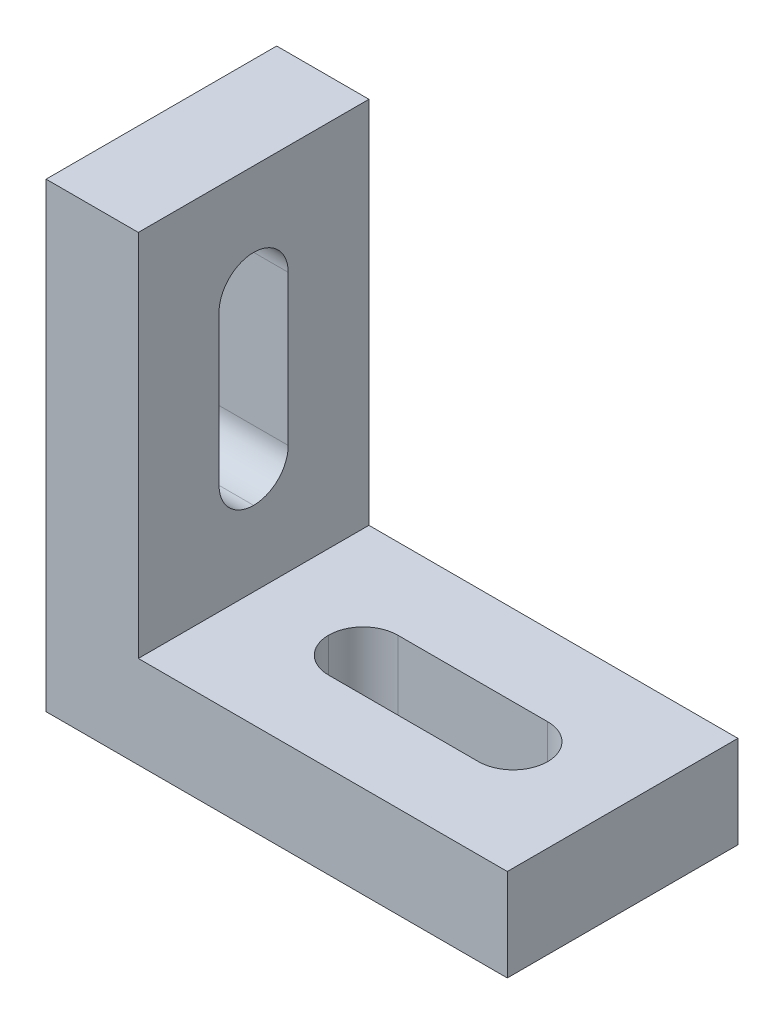
ISO-10303-21;
HEADER;
FILE_DESCRIPTION(('STEP AP214'),'2;1');
FILE_NAME('part.step','',(''),(''),'','','');
FILE_SCHEMA(('AUTOMOTIVE_DESIGN { 1 0 10303 214 1 1 1 1 }'));
ENDSEC;
DATA;
#1=APPLICATION_CONTEXT('core data for automotive mechanical design processes');
#2=APPLICATION_PROTOCOL_DEFINITION('international standard','automotive_design',2000,#1);
#3=PRODUCT_CONTEXT('',#1,'mechanical');
#4=PRODUCT('Part','Part','',(#3));
#5=PRODUCT_RELATED_PRODUCT_CATEGORY('part','',(#4));
#6=PRODUCT_DEFINITION_FORMATION('','',#4);
#7=PRODUCT_DEFINITION_CONTEXT('part definition',#1,'design');
#8=PRODUCT_DEFINITION('design','',#6,#7);
#9=PRODUCT_DEFINITION_SHAPE('','',#8);
#10=(LENGTH_UNIT() NAMED_UNIT(*) SI_UNIT(.MILLI.,.METRE.));
#11=(NAMED_UNIT(*) PLANE_ANGLE_UNIT() SI_UNIT($,.RADIAN.));
#12=(NAMED_UNIT(*) SI_UNIT($,.STERADIAN.) SOLID_ANGLE_UNIT());
#13=UNCERTAINTY_MEASURE_WITH_UNIT(LENGTH_MEASURE(1.E-05),#10,'distance_accuracy_value','');
#14=(GEOMETRIC_REPRESENTATION_CONTEXT(3) GLOBAL_UNCERTAINTY_ASSIGNED_CONTEXT((#13)) GLOBAL_UNIT_ASSIGNED_CONTEXT((#10,
#11,#12)) REPRESENTATION_CONTEXT('',''));
#15=CARTESIAN_POINT('',(0.,0.,0.));
#16=DIRECTION('',(0.,0.,1.));
#17=DIRECTION('',(1.,0.,0.));
#18=AXIS2_PLACEMENT_3D('',#15,#16,#17);
#19=CARTESIAN_POINT('',(4.,-20.,20.));
#20=DIRECTION('',(0.,1.,0.));
#21=DIRECTION('',(0.,0.,1.));
#22=AXIS2_PLACEMENT_3D('',#19,#20,#21);
#23=PLANE('',#22);
#24=DIRECTION('',(1.,0.,0.));
#25=VECTOR('',#24,1.);
#26=CARTESIAN_POINT('',(4.,-20.,13.));
#27=LINE('',#26,#25);
#28=CARTESIAN_POINT('',(13.5,-20.,13.));
#29=VERTEX_POINT('',#28);
#30=CARTESIAN_POINT('',(26.5,-20.,13.));
#31=VERTEX_POINT('',#30);
#32=EDGE_CURVE('E368',#29,#31,#27,.T.);
#33=ORIENTED_EDGE('',*,*,#32,.T.);
#34=CARTESIAN_POINT('',(26.5,-20.,10.));
#35=DIRECTION('',(0.,1.,0.));
#36=DIRECTION('',(0.,0.,1.));
#37=AXIS2_PLACEMENT_3D('',#34,#35,#36);
#38=CIRCLE('',#37,3.);
#39=CARTESIAN_POINT('',(29.5,-20.,10.));
#40=VERTEX_POINT('',#39);
#41=EDGE_CURVE('E288',#31,#40,#38,.T.);
#42=ORIENTED_EDGE('',*,*,#41,.T.);
#43=CARTESIAN_POINT('',(26.5,-20.,10.));
#44=DIRECTION('',(0.,1.,0.));
#45=DIRECTION('',(0.,0.,1.));
#46=AXIS2_PLACEMENT_3D('',#43,#44,#45);
#47=CIRCLE('',#46,3.);
#48=CARTESIAN_POINT('',(26.5,-20.,7.));
#49=VERTEX_POINT('',#48);
#50=EDGE_CURVE('E282',#40,#49,#47,.T.);
#51=ORIENTED_EDGE('',*,*,#50,.T.);
#52=DIRECTION('',(-1.,0.,0.));
#53=VECTOR('',#52,1.);
#54=CARTESIAN_POINT('',(4.,-20.,7.00000000000001));
#55=LINE('',#54,#53);
#56=CARTESIAN_POINT('',(13.5,-20.,7.));
#57=VERTEX_POINT('',#56);
#58=EDGE_CURVE('E214',#49,#57,#55,.T.);
#59=ORIENTED_EDGE('',*,*,#58,.T.);
#60=CARTESIAN_POINT('',(13.5,-20.,10.));
#61=DIRECTION('',(0.,1.,0.));
#62=DIRECTION('',(0.,0.,1.));
#63=AXIS2_PLACEMENT_3D('',#60,#61,#62);
#64=CIRCLE('',#63,3.);
#65=CARTESIAN_POINT('',(10.5,-20.,10.));
#66=VERTEX_POINT('',#65);
#67=EDGE_CURVE('E294',#57,#66,#64,.T.);
#68=ORIENTED_EDGE('',*,*,#67,.T.);
#69=CARTESIAN_POINT('',(13.5,-20.,10.));
#70=DIRECTION('',(0.,1.,0.));
#71=DIRECTION('',(0.,0.,1.));
#72=AXIS2_PLACEMENT_3D('',#69,#70,#71);
#73=CIRCLE('',#72,3.);
#74=EDGE_CURVE('E300',#66,#29,#73,.T.);
#75=ORIENTED_EDGE('',*,*,#74,.T.);
#76=EDGE_LOOP('',(#33,#42,#51,#59,#68,#75));
#77=FACE_BOUND('',#76,.T.);
#78=DIRECTION('',(1.,0.,0.));
#79=VECTOR('',#78,1.);
#80=CARTESIAN_POINT('',(4.,-20.,0.));
#81=LINE('',#80,#79);
#82=CARTESIAN_POINT('',(-4.,-20.,0.));
#83=VERTEX_POINT('',#82);
#84=CARTESIAN_POINT('',(36.,-20.,0.));
#85=VERTEX_POINT('',#84);
#86=EDGE_CURVE('E185',#83,#85,#81,.T.);
#87=ORIENTED_EDGE('',*,*,#86,.T.);
#88=DIRECTION('',(0.,0.,-1.));
#89=VECTOR('',#88,1.);
#90=CARTESIAN_POINT('',(36.,-20.,20.));
#91=LINE('',#90,#89);
#92=CARTESIAN_POINT('',(36.,-20.,20.));
#93=VERTEX_POINT('',#92);
#94=EDGE_CURVE('E184',#93,#85,#91,.T.);
#95=ORIENTED_EDGE('',*,*,#94,.F.);
#96=DIRECTION('',(1.,0.,0.));
#97=VECTOR('',#96,1.);
#98=CARTESIAN_POINT('',(-4.,-20.,20.));
#99=LINE('',#98,#97);
#100=CARTESIAN_POINT('',(-4.,-20.,20.));
#101=VERTEX_POINT('',#100);
#102=EDGE_CURVE('E169',#101,#93,#99,.T.);
#103=ORIENTED_EDGE('',*,*,#102,.F.);
#104=DIRECTION('',(0.,0.,-1.));
#105=VECTOR('',#104,1.);
#106=CARTESIAN_POINT('',(-4.,-20.,20.));
#107=LINE('',#106,#105);
#108=EDGE_CURVE('E210',#101,#83,#107,.T.);
#109=ORIENTED_EDGE('',*,*,#108,.T.);
#110=EDGE_LOOP('',(#87,#95,#103,#109));
#111=FACE_BOUND('',#110,.T.);
#112=ADVANCED_FACE('F43',(#77,#111),#23,.F.);
#113=CARTESIAN_POINT('',(36.,-20.,20.));
#114=DIRECTION('',(-1.,0.,0.));
#115=DIRECTION('',(0.,0.,1.));
#116=AXIS2_PLACEMENT_3D('',#113,#114,#115);
#117=PLANE('',#116);
#118=DIRECTION('',(0.,1.,0.));
#119=VECTOR('',#118,1.);
#120=CARTESIAN_POINT('',(36.,-20.,0.));
#121=LINE('',#120,#119);
#122=CARTESIAN_POINT('',(36.,-12.,0.));
#123=VERTEX_POINT('',#122);
#124=EDGE_CURVE('E213',#85,#123,#121,.T.);
#125=ORIENTED_EDGE('',*,*,#124,.T.);
#126=DIRECTION('',(0.,0.,-1.));
#127=VECTOR('',#126,1.);
#128=CARTESIAN_POINT('',(36.,-12.,20.));
#129=LINE('',#128,#127);
#130=CARTESIAN_POINT('',(36.,-12.,20.));
#131=VERTEX_POINT('',#130);
#132=EDGE_CURVE('E190',#131,#123,#129,.T.);
#133=ORIENTED_EDGE('',*,*,#132,.F.);
#134=DIRECTION('',(0.,1.,0.));
#135=VECTOR('',#134,1.);
#136=CARTESIAN_POINT('',(36.,-20.,20.));
#137=LINE('',#136,#135);
#138=EDGE_CURVE('E173',#93,#131,#137,.T.);
#139=ORIENTED_EDGE('',*,*,#138,.F.);
#140=ORIENTED_EDGE('',*,*,#94,.T.);
#141=EDGE_LOOP('',(#125,#133,#139,#140));
#142=FACE_BOUND('',#141,.T.);
#143=ADVANCED_FACE('F192',(#142),#117,.F.);
#144=CARTESIAN_POINT('',(36.,-12.,20.));
#145=DIRECTION('',(0.,-1.,0.));
#146=DIRECTION('',(0.,0.,-1.));
#147=AXIS2_PLACEMENT_3D('',#144,#145,#146);
#148=PLANE('',#147);
#149=DIRECTION('',(1.,0.,0.));
#150=VECTOR('',#149,1.);
#151=CARTESIAN_POINT('',(29.5,-12.,13.));
#152=LINE('',#151,#150);
#153=CARTESIAN_POINT('',(13.5,-12.,13.));
#154=VERTEX_POINT('',#153);
#155=CARTESIAN_POINT('',(26.5,-12.,13.));
#156=VERTEX_POINT('',#155);
#157=EDGE_CURVE('E358',#154,#156,#152,.T.);
#158=ORIENTED_EDGE('',*,*,#157,.F.);
#159=CARTESIAN_POINT('',(13.5,-12.,10.));
#160=DIRECTION('',(0.,-1.,0.));
#161=DIRECTION('',(0.,0.,-1.));
#162=AXIS2_PLACEMENT_3D('',#159,#160,#161);
#163=CIRCLE('',#162,3.);
#164=CARTESIAN_POINT('',(10.5,-12.,10.));
#165=VERTEX_POINT('',#164);
#166=EDGE_CURVE('E297',#154,#165,#163,.T.);
#167=ORIENTED_EDGE('',*,*,#166,.T.);
#168=CARTESIAN_POINT('',(13.5,-12.,10.));
#169=DIRECTION('',(0.,-1.,0.));
#170=DIRECTION('',(0.,0.,-1.));
#171=AXIS2_PLACEMENT_3D('',#168,#169,#170);
#172=CIRCLE('',#171,3.);
#173=CARTESIAN_POINT('',(13.5,-12.,7.));
#174=VERTEX_POINT('',#173);
#175=EDGE_CURVE('E291',#165,#174,#172,.T.);
#176=ORIENTED_EDGE('',*,*,#175,.T.);
#177=DIRECTION('',(-1.,0.,0.));
#178=VECTOR('',#177,1.);
#179=CARTESIAN_POINT('',(29.5,-12.,7.));
#180=LINE('',#179,#178);
#181=CARTESIAN_POINT('',(26.5,-12.,7.));
#182=VERTEX_POINT('',#181);
#183=EDGE_CURVE('E364',#182,#174,#180,.T.);
#184=ORIENTED_EDGE('',*,*,#183,.F.);
#185=CARTESIAN_POINT('',(26.5,-12.,10.));
#186=DIRECTION('',(0.,-1.,0.));
#187=DIRECTION('',(0.,0.,-1.));
#188=AXIS2_PLACEMENT_3D('',#185,#186,#187);
#189=CIRCLE('',#188,3.);
#190=CARTESIAN_POINT('',(29.5,-12.,10.));
#191=VERTEX_POINT('',#190);
#192=EDGE_CURVE('E279',#182,#191,#189,.T.);
#193=ORIENTED_EDGE('',*,*,#192,.T.);
#194=CARTESIAN_POINT('',(26.5,-12.,10.));
#195=DIRECTION('',(0.,-1.,0.));
#196=DIRECTION('',(0.,0.,-1.));
#197=AXIS2_PLACEMENT_3D('',#194,#195,#196);
#198=CIRCLE('',#197,3.);
#199=EDGE_CURVE('E285',#191,#156,#198,.T.);
#200=ORIENTED_EDGE('',*,*,#199,.T.);
#201=EDGE_LOOP('',(#158,#167,#176,#184,#193,#200));
#202=FACE_BOUND('',#201,.T.);
#203=DIRECTION('',(-1.,0.,0.));
#204=VECTOR('',#203,1.);
#205=CARTESIAN_POINT('',(36.,-12.,0.));
#206=LINE('',#205,#204);
#207=CARTESIAN_POINT('',(4.,-12.,0.));
#208=VERTEX_POINT('',#207);
#209=EDGE_CURVE('E217',#123,#208,#206,.T.);
#210=ORIENTED_EDGE('',*,*,#209,.T.);
#211=DIRECTION('',(0.,0.,-1.));
#212=VECTOR('',#211,1.);
#213=CARTESIAN_POINT('',(4.,-12.,20.));
#214=LINE('',#213,#212);
#215=CARTESIAN_POINT('',(4.,-12.,20.));
#216=VERTEX_POINT('',#215);
#217=EDGE_CURVE('E239',#216,#208,#214,.T.);
#218=ORIENTED_EDGE('',*,*,#217,.F.);
#219=DIRECTION('',(-1.,0.,0.));
#220=VECTOR('',#219,1.);
#221=CARTESIAN_POINT('',(36.,-12.,20.));
#222=LINE('',#221,#220);
#223=EDGE_CURVE('E196',#131,#216,#222,.T.);
#224=ORIENTED_EDGE('',*,*,#223,.F.);
#225=ORIENTED_EDGE('',*,*,#132,.T.);
#226=EDGE_LOOP('',(#210,#218,#224,#225));
#227=FACE_BOUND('',#226,.T.);
#228=ADVANCED_FACE('F388',(#202,#227),#148,.F.);
#229=CARTESIAN_POINT('',(4.,20.,20.));
#230=DIRECTION('',(-1.,0.,0.));
#231=DIRECTION('',(0.,-1.,0.));
#232=AXIS2_PLACEMENT_3D('',#229,#230,#231);
#233=PLANE('',#232);
#234=CARTESIAN_POINT('',(4.,10.5,10.));
#235=DIRECTION('',(-1.,0.,0.));
#236=DIRECTION('',(0.,-1.,0.));
#237=AXIS2_PLACEMENT_3D('',#234,#235,#236);
#238=CIRCLE('',#237,3.);
#239=CARTESIAN_POINT('',(4.,10.5,13.));
#240=VERTEX_POINT('',#239);
#241=CARTESIAN_POINT('',(4.,13.5,10.));
#242=VERTEX_POINT('',#241);
#243=EDGE_CURVE('E67',#240,#242,#238,.T.);
#244=ORIENTED_EDGE('',*,*,#243,.T.);
#245=CARTESIAN_POINT('',(4.,10.5,10.));
#246=DIRECTION('',(-1.,0.,0.));
#247=DIRECTION('',(0.,-1.,0.));
#248=AXIS2_PLACEMENT_3D('',#245,#246,#247);
#249=CIRCLE('',#248,3.);
#250=CARTESIAN_POINT('',(4.,10.5,7.));
#251=VERTEX_POINT('',#250);
#252=EDGE_CURVE('E53',#242,#251,#249,.T.);
#253=ORIENTED_EDGE('',*,*,#252,.T.);
#254=DIRECTION('',(0.,1.,0.));
#255=VECTOR('',#254,1.);
#256=CARTESIAN_POINT('',(4.,-5.5,7.));
#257=LINE('',#256,#255);
#258=CARTESIAN_POINT('',(4.,-2.5,7.));
#259=VERTEX_POINT('',#258);
#260=EDGE_CURVE('E326',#259,#251,#257,.T.);
#261=ORIENTED_EDGE('',*,*,#260,.F.);
#262=CARTESIAN_POINT('',(4.,-2.5,10.));
#263=DIRECTION('',(-1.,0.,0.));
#264=DIRECTION('',(0.,-1.,0.));
#265=AXIS2_PLACEMENT_3D('',#262,#263,#264);
#266=CIRCLE('',#265,3.);
#267=CARTESIAN_POINT('',(4.,-5.5,10.));
#268=VERTEX_POINT('',#267);
#269=EDGE_CURVE('E309',#259,#268,#266,.T.);
#270=ORIENTED_EDGE('',*,*,#269,.T.);
#271=CARTESIAN_POINT('',(4.,-2.5,10.));
#272=DIRECTION('',(-1.,0.,0.));
#273=DIRECTION('',(0.,-1.,0.));
#274=AXIS2_PLACEMENT_3D('',#271,#272,#273);
#275=CIRCLE('',#274,3.);
#276=CARTESIAN_POINT('',(4.,-2.5,13.));
#277=VERTEX_POINT('',#276);
#278=EDGE_CURVE('E303',#268,#277,#275,.T.);
#279=ORIENTED_EDGE('',*,*,#278,.T.);
#280=DIRECTION('',(0.,-1.,0.));
#281=VECTOR('',#280,1.);
#282=CARTESIAN_POINT('',(4.,-5.5,13.));
#283=LINE('',#282,#281);
#284=EDGE_CURVE('E354',#240,#277,#283,.T.);
#285=ORIENTED_EDGE('',*,*,#284,.F.);
#286=EDGE_LOOP('',(#244,#253,#261,#270,#279,#285));
#287=FACE_BOUND('',#286,.T.);
#288=DIRECTION('',(0.,1.,0.));
#289=VECTOR('',#288,1.);
#290=CARTESIAN_POINT('',(4.,20.,0.));
#291=LINE('',#290,#289);
#292=CARTESIAN_POINT('',(4.,20.,0.));
#293=VERTEX_POINT('',#292);
#294=EDGE_CURVE('E220',#208,#293,#291,.T.);
#295=ORIENTED_EDGE('',*,*,#294,.T.);
#296=DIRECTION('',(0.,0.,-1.));
#297=VECTOR('',#296,1.);
#298=CARTESIAN_POINT('',(4.,20.,20.));
#299=LINE('',#298,#297);
#300=CARTESIAN_POINT('',(4.,20.,20.));
#301=VERTEX_POINT('',#300);
#302=EDGE_CURVE('E235',#301,#293,#299,.T.);
#303=ORIENTED_EDGE('',*,*,#302,.F.);
#304=DIRECTION('',(0.,1.,0.));
#305=VECTOR('',#304,1.);
#306=CARTESIAN_POINT('',(4.,20.,20.));
#307=LINE('',#306,#305);
#308=EDGE_CURVE('E199',#216,#301,#307,.T.);
#309=ORIENTED_EDGE('',*,*,#308,.F.);
#310=ORIENTED_EDGE('',*,*,#217,.T.);
#311=EDGE_LOOP('',(#295,#303,#309,#310));
#312=FACE_BOUND('',#311,.T.);
#313=ADVANCED_FACE('F346',(#287,#312),#233,.F.);
#314=CARTESIAN_POINT('',(-4.,20.,20.));
#315=DIRECTION('',(0.,-1.,0.));
#316=DIRECTION('',(0.,0.,-1.));
#317=AXIS2_PLACEMENT_3D('',#314,#315,#316);
#318=PLANE('',#317);
#319=DIRECTION('',(-1.,0.,0.));
#320=VECTOR('',#319,1.);
#321=CARTESIAN_POINT('',(-4.,20.,0.));
#322=LINE('',#321,#320);
#323=CARTESIAN_POINT('',(-4.,20.,0.));
#324=VERTEX_POINT('',#323);
#325=EDGE_CURVE('E223',#293,#324,#322,.T.);
#326=ORIENTED_EDGE('',*,*,#325,.T.);
#327=DIRECTION('',(0.,0.,-1.));
#328=VECTOR('',#327,1.);
#329=CARTESIAN_POINT('',(-4.,20.,20.));
#330=LINE('',#329,#328);
#331=CARTESIAN_POINT('',(-4.,20.,20.));
#332=VERTEX_POINT('',#331);
#333=EDGE_CURVE('E231',#332,#324,#330,.T.);
#334=ORIENTED_EDGE('',*,*,#333,.F.);
#335=DIRECTION('',(-1.,0.,0.));
#336=VECTOR('',#335,1.);
#337=CARTESIAN_POINT('',(-4.,20.,20.));
#338=LINE('',#337,#336);
#339=EDGE_CURVE('E205',#301,#332,#338,.T.);
#340=ORIENTED_EDGE('',*,*,#339,.F.);
#341=ORIENTED_EDGE('',*,*,#302,.T.);
#342=EDGE_LOOP('',(#326,#334,#340,#341));
#343=FACE_BOUND('',#342,.T.);
#344=ADVANCED_FACE('F451',(#343),#318,.F.);
#345=CARTESIAN_POINT('',(-4.,20.,20.));
#346=DIRECTION('',(1.,0.,0.));
#347=DIRECTION('',(0.,1.,0.));
#348=AXIS2_PLACEMENT_3D('',#345,#346,#347);
#349=PLANE('',#348);
#350=CARTESIAN_POINT('',(-4.,-2.5,10.));
#351=DIRECTION('',(1.,0.,0.));
#352=DIRECTION('',(0.,1.,0.));
#353=AXIS2_PLACEMENT_3D('',#350,#351,#352);
#354=CIRCLE('',#353,3.);
#355=CARTESIAN_POINT('',(-4.,-2.5,13.));
#356=VERTEX_POINT('',#355);
#357=CARTESIAN_POINT('',(-4.,-5.5,10.));
#358=VERTEX_POINT('',#357);
#359=EDGE_CURVE('E306',#356,#358,#354,.T.);
#360=ORIENTED_EDGE('',*,*,#359,.T.);
#361=CARTESIAN_POINT('',(-4.,-2.5,10.));
#362=DIRECTION('',(1.,0.,0.));
#363=DIRECTION('',(0.,1.,0.));
#364=AXIS2_PLACEMENT_3D('',#361,#362,#363);
#365=CIRCLE('',#364,3.);
#366=CARTESIAN_POINT('',(-4.,-2.5,7.));
#367=VERTEX_POINT('',#366);
#368=EDGE_CURVE('E312',#358,#367,#365,.T.);
#369=ORIENTED_EDGE('',*,*,#368,.T.);
#370=DIRECTION('',(0.,1.,0.));
#371=VECTOR('',#370,1.);
#372=CARTESIAN_POINT('',(-4.,20.,7.));
#373=LINE('',#372,#371);
#374=CARTESIAN_POINT('',(-4.,10.5,7.));
#375=VERTEX_POINT('',#374);
#376=EDGE_CURVE('E248',#367,#375,#373,.T.);
#377=ORIENTED_EDGE('',*,*,#376,.T.);
#378=CARTESIAN_POINT('',(-4.,10.5,10.));
#379=DIRECTION('',(1.,0.,0.));
#380=DIRECTION('',(0.,1.,0.));
#381=AXIS2_PLACEMENT_3D('',#378,#379,#380);
#382=CIRCLE('',#381,3.);
#383=CARTESIAN_POINT('',(-4.,13.5,10.));
#384=VERTEX_POINT('',#383);
#385=EDGE_CURVE('E11',#375,#384,#382,.T.);
#386=ORIENTED_EDGE('',*,*,#385,.T.);
#387=CARTESIAN_POINT('',(-4.,10.5,10.));
#388=DIRECTION('',(1.,0.,0.));
#389=DIRECTION('',(0.,1.,0.));
#390=AXIS2_PLACEMENT_3D('',#387,#388,#389);
#391=CIRCLE('',#390,3.);
#392=CARTESIAN_POINT('',(-4.,10.5,13.));
#393=VERTEX_POINT('',#392);
#394=EDGE_CURVE('E317',#384,#393,#391,.T.);
#395=ORIENTED_EDGE('',*,*,#394,.T.);
#396=DIRECTION('',(0.,-1.,0.));
#397=VECTOR('',#396,1.);
#398=CARTESIAN_POINT('',(-4.,20.,13.));
#399=LINE('',#398,#397);
#400=EDGE_CURVE('E189',#393,#356,#399,.T.);
#401=ORIENTED_EDGE('',*,*,#400,.T.);
#402=EDGE_LOOP('',(#360,#369,#377,#386,#395,#401));
#403=FACE_BOUND('',#402,.T.);
#404=DIRECTION('',(0.,-1.,0.));
#405=VECTOR('',#404,1.);
#406=CARTESIAN_POINT('',(-4.,20.,0.));
#407=LINE('',#406,#405);
#408=EDGE_CURVE('E181',#324,#83,#407,.T.);
#409=ORIENTED_EDGE('',*,*,#408,.T.);
#410=ORIENTED_EDGE('',*,*,#108,.F.);
#411=DIRECTION('',(0.,-1.,0.));
#412=VECTOR('',#411,1.);
#413=CARTESIAN_POINT('',(-4.,20.,20.));
#414=LINE('',#413,#412);
#415=EDGE_CURVE('E176',#332,#101,#414,.T.);
#416=ORIENTED_EDGE('',*,*,#415,.F.);
#417=ORIENTED_EDGE('',*,*,#333,.T.);
#418=EDGE_LOOP('',(#409,#410,#416,#417));
#419=FACE_BOUND('',#418,.T.);
#420=ADVANCED_FACE('F445',(#403,#419),#349,.F.);
#421=CARTESIAN_POINT('',(0.,0.,20.));
#422=DIRECTION('',(0.,0.,1.));
#423=DIRECTION('',(1.,0.,0.));
#424=AXIS2_PLACEMENT_3D('',#421,#422,#423);
#425=PLANE('',#424);
#426=ORIENTED_EDGE('',*,*,#102,.T.);
#427=ORIENTED_EDGE('',*,*,#138,.T.);
#428=ORIENTED_EDGE('',*,*,#223,.T.);
#429=ORIENTED_EDGE('',*,*,#308,.T.);
#430=ORIENTED_EDGE('',*,*,#339,.T.);
#431=ORIENTED_EDGE('',*,*,#415,.T.);
#432=EDGE_LOOP('',(#426,#427,#428,#429,#430,#431));
#433=FACE_BOUND('',#432,.T.);
#434=ADVANCED_FACE('F171',(#433),#425,.T.);
#435=CARTESIAN_POINT('',(0.,0.,0.));
#436=DIRECTION('',(0.,0.,1.));
#437=DIRECTION('',(1.,0.,0.));
#438=AXIS2_PLACEMENT_3D('',#435,#436,#437);
#439=PLANE('',#438);
#440=ORIENTED_EDGE('',*,*,#86,.F.);
#441=ORIENTED_EDGE('',*,*,#408,.F.);
#442=ORIENTED_EDGE('',*,*,#325,.F.);
#443=ORIENTED_EDGE('',*,*,#294,.F.);
#444=ORIENTED_EDGE('',*,*,#209,.F.);
#445=ORIENTED_EDGE('',*,*,#124,.F.);
#446=EDGE_LOOP('',(#440,#441,#442,#443,#444,#445));
#447=FACE_BOUND('',#446,.T.);
#448=ADVANCED_FACE('F440',(#447),#439,.F.);
#449=CARTESIAN_POINT('',(29.5,-32.,7.));
#450=DIRECTION('',(0.,0.,-1.));
#451=DIRECTION('',(-1.,0.,0.));
#452=AXIS2_PLACEMENT_3D('',#449,#450,#451);
#453=PLANE('',#452);
#454=ORIENTED_EDGE('',*,*,#58,.F.);
#455=DIRECTION('',(0.,1.,0.));
#456=VECTOR('',#455,1.);
#457=CARTESIAN_POINT('',(26.5,-12.,7.));
#458=LINE('',#457,#456);
#459=EDGE_CURVE('E255',#49,#182,#458,.T.);
#460=ORIENTED_EDGE('',*,*,#459,.T.);
#461=ORIENTED_EDGE('',*,*,#183,.T.);
#462=DIRECTION('',(0.,1.,0.));
#463=VECTOR('',#462,1.);
#464=CARTESIAN_POINT('',(13.5,-20.,7.));
#465=LINE('',#464,#463);
#466=EDGE_CURVE('E251',#174,#57,#465,.F.);
#467=ORIENTED_EDGE('',*,*,#466,.T.);
#468=EDGE_LOOP('',(#454,#460,#461,#467));
#469=FACE_BOUND('',#468,.T.);
#470=ADVANCED_FACE('F379',(#469),#453,.F.);
#471=CARTESIAN_POINT('',(29.5,-32.,13.));
#472=DIRECTION('',(0.,0.,1.));
#473=DIRECTION('',(1.,0.,0.));
#474=AXIS2_PLACEMENT_3D('',#471,#472,#473);
#475=PLANE('',#474);
#476=ORIENTED_EDGE('',*,*,#157,.T.);
#477=DIRECTION('',(0.,1.,0.));
#478=VECTOR('',#477,1.);
#479=CARTESIAN_POINT('',(26.5,-20.,13.));
#480=LINE('',#479,#478);
#481=EDGE_CURVE('E262',#156,#31,#480,.F.);
#482=ORIENTED_EDGE('',*,*,#481,.T.);
#483=ORIENTED_EDGE('',*,*,#32,.F.);
#484=DIRECTION('',(0.,1.,0.));
#485=VECTOR('',#484,1.);
#486=CARTESIAN_POINT('',(13.5,-12.,13.));
#487=LINE('',#486,#485);
#488=EDGE_CURVE('E259',#29,#154,#487,.T.);
#489=ORIENTED_EDGE('',*,*,#488,.T.);
#490=EDGE_LOOP('',(#476,#482,#483,#489));
#491=FACE_BOUND('',#490,.T.);
#492=ADVANCED_FACE('F396',(#491),#475,.F.);
#493=CARTESIAN_POINT('',(-16.,-5.5,7.));
#494=DIRECTION('',(0.,0.,-1.));
#495=DIRECTION('',(-1.,0.,0.));
#496=AXIS2_PLACEMENT_3D('',#493,#494,#495);
#497=PLANE('',#496);
#498=ORIENTED_EDGE('',*,*,#376,.F.);
#499=DIRECTION('',(1.,0.,0.));
#500=VECTOR('',#499,1.);
#501=CARTESIAN_POINT('',(4.,-2.5,7.));
#502=LINE('',#501,#500);
#503=EDGE_CURVE('E276',#367,#259,#502,.T.);
#504=ORIENTED_EDGE('',*,*,#503,.T.);
#505=ORIENTED_EDGE('',*,*,#260,.T.);
#506=DIRECTION('',(1.,0.,0.));
#507=VECTOR('',#506,1.);
#508=CARTESIAN_POINT('',(-4.,10.5,7.));
#509=LINE('',#508,#507);
#510=EDGE_CURVE('E273',#251,#375,#509,.F.);
#511=ORIENTED_EDGE('',*,*,#510,.T.);
#512=EDGE_LOOP('',(#498,#504,#505,#511));
#513=FACE_BOUND('',#512,.T.);
#514=ADVANCED_FACE('F351',(#513),#497,.F.);
#515=CARTESIAN_POINT('',(-16.,-5.5,13.));
#516=DIRECTION('',(0.,0.,1.));
#517=DIRECTION('',(1.,0.,0.));
#518=AXIS2_PLACEMENT_3D('',#515,#516,#517);
#519=PLANE('',#518);
#520=ORIENTED_EDGE('',*,*,#284,.T.);
#521=DIRECTION('',(1.,0.,0.));
#522=VECTOR('',#521,1.);
#523=CARTESIAN_POINT('',(-4.,-2.5,13.));
#524=LINE('',#523,#522);
#525=EDGE_CURVE('E269',#277,#356,#524,.F.);
#526=ORIENTED_EDGE('',*,*,#525,.T.);
#527=ORIENTED_EDGE('',*,*,#400,.F.);
#528=DIRECTION('',(1.,0.,0.));
#529=VECTOR('',#528,1.);
#530=CARTESIAN_POINT('',(4.,10.5,13.));
#531=LINE('',#530,#529);
#532=EDGE_CURVE('E265',#393,#240,#531,.T.);
#533=ORIENTED_EDGE('',*,*,#532,.T.);
#534=EDGE_LOOP('',(#520,#526,#527,#533));
#535=FACE_BOUND('',#534,.T.);
#536=ADVANCED_FACE('F427',(#535),#519,.F.);
#537=CARTESIAN_POINT('',(26.5,-32.,10.));
#538=DIRECTION('',(0.,-1.,0.));
#539=DIRECTION('',(0.,0.,-1.));
#540=AXIS2_PLACEMENT_3D('',#537,#538,#539);
#541=CYLINDRICAL_SURFACE('',#540,3.);
#542=DIRECTION('',(0.,1.,0.));
#543=VECTOR('',#542,1.);
#544=CARTESIAN_POINT('',(29.5,-12.,10.));
#545=LINE('',#544,#543);
#546=EDGE_CURVE('E322',#40,#191,#545,.T.);
#547=ORIENTED_EDGE('',*,*,#546,.F.);
#548=ORIENTED_EDGE('',*,*,#41,.F.);
#549=ORIENTED_EDGE('',*,*,#481,.F.);
#550=ORIENTED_EDGE('',*,*,#199,.F.);
#551=EDGE_LOOP('',(#547,#548,#549,#550));
#552=FACE_BOUND('',#551,.T.);
#553=ADVANCED_FACE('F392',(#552),#541,.F.);
#554=CARTESIAN_POINT('',(26.5,-32.,10.));
#555=DIRECTION('',(0.,-1.,0.));
#556=DIRECTION('',(0.,0.,-1.));
#557=AXIS2_PLACEMENT_3D('',#554,#555,#556);
#558=CYLINDRICAL_SURFACE('',#557,3.);
#559=ORIENTED_EDGE('',*,*,#50,.F.);
#560=ORIENTED_EDGE('',*,*,#546,.T.);
#561=ORIENTED_EDGE('',*,*,#192,.F.);
#562=ORIENTED_EDGE('',*,*,#459,.F.);
#563=EDGE_LOOP('',(#559,#560,#561,#562));
#564=FACE_BOUND('',#563,.T.);
#565=ADVANCED_FACE('F383',(#564),#558,.F.);
#566=CARTESIAN_POINT('',(13.5,-32.,10.));
#567=DIRECTION('',(0.,-1.,0.));
#568=DIRECTION('',(0.,0.,-1.));
#569=AXIS2_PLACEMENT_3D('',#566,#567,#568);
#570=CYLINDRICAL_SURFACE('',#569,3.);
#571=ORIENTED_EDGE('',*,*,#488,.F.);
#572=ORIENTED_EDGE('',*,*,#74,.F.);
#573=DIRECTION('',(0.,1.,0.));
#574=VECTOR('',#573,1.);
#575=CARTESIAN_POINT('',(10.5,-20.,10.));
#576=LINE('',#575,#574);
#577=EDGE_CURVE('E327',#165,#66,#576,.F.);
#578=ORIENTED_EDGE('',*,*,#577,.F.);
#579=ORIENTED_EDGE('',*,*,#166,.F.);
#580=EDGE_LOOP('',(#571,#572,#578,#579));
#581=FACE_BOUND('',#580,.T.);
#582=ADVANCED_FACE('F400',(#581),#570,.F.);
#583=CARTESIAN_POINT('',(13.5,-32.,10.));
#584=DIRECTION('',(0.,-1.,0.));
#585=DIRECTION('',(0.,0.,-1.));
#586=AXIS2_PLACEMENT_3D('',#583,#584,#585);
#587=CYLINDRICAL_SURFACE('',#586,3.);
#588=ORIENTED_EDGE('',*,*,#67,.F.);
#589=ORIENTED_EDGE('',*,*,#466,.F.);
#590=ORIENTED_EDGE('',*,*,#175,.F.);
#591=ORIENTED_EDGE('',*,*,#577,.T.);
#592=EDGE_LOOP('',(#588,#589,#590,#591));
#593=FACE_BOUND('',#592,.T.);
#594=ADVANCED_FACE('F404',(#593),#587,.F.);
#595=CARTESIAN_POINT('',(-16.,-2.5,10.));
#596=DIRECTION('',(-1.,0.,0.));
#597=DIRECTION('',(0.,-1.,0.));
#598=AXIS2_PLACEMENT_3D('',#595,#596,#597);
#599=CYLINDRICAL_SURFACE('',#598,3.);
#600=ORIENTED_EDGE('',*,*,#503,.F.);
#601=ORIENTED_EDGE('',*,*,#368,.F.);
#602=DIRECTION('',(1.,0.,0.));
#603=VECTOR('',#602,1.);
#604=CARTESIAN_POINT('',(-4.,-5.5,10.));
#605=LINE('',#604,#603);
#606=EDGE_CURVE('E330',#268,#358,#605,.F.);
#607=ORIENTED_EDGE('',*,*,#606,.F.);
#608=ORIENTED_EDGE('',*,*,#269,.F.);
#609=EDGE_LOOP('',(#600,#601,#607,#608));
#610=FACE_BOUND('',#609,.T.);
#611=ADVANCED_FACE('F406',(#610),#599,.F.);
#612=CARTESIAN_POINT('',(-16.,-2.5,10.));
#613=DIRECTION('',(-1.,0.,0.));
#614=DIRECTION('',(0.,-1.,0.));
#615=AXIS2_PLACEMENT_3D('',#612,#613,#614);
#616=CYLINDRICAL_SURFACE('',#615,3.);
#617=ORIENTED_EDGE('',*,*,#359,.F.);
#618=ORIENTED_EDGE('',*,*,#525,.F.);
#619=ORIENTED_EDGE('',*,*,#278,.F.);
#620=ORIENTED_EDGE('',*,*,#606,.T.);
#621=EDGE_LOOP('',(#617,#618,#619,#620));
#622=FACE_BOUND('',#621,.T.);
#623=ADVANCED_FACE('F412',(#622),#616,.F.);
#624=CARTESIAN_POINT('',(-16.,10.5,10.));
#625=DIRECTION('',(-1.,0.,0.));
#626=DIRECTION('',(0.,-1.,0.));
#627=AXIS2_PLACEMENT_3D('',#624,#625,#626);
#628=CYLINDRICAL_SURFACE('',#627,3.);
#629=DIRECTION('',(1.,0.,0.));
#630=VECTOR('',#629,1.);
#631=CARTESIAN_POINT('',(4.,13.5,10.));
#632=LINE('',#631,#630);
#633=EDGE_CURVE('E47',#384,#242,#632,.T.);
#634=ORIENTED_EDGE('',*,*,#633,.F.);
#635=ORIENTED_EDGE('',*,*,#385,.F.);
#636=ORIENTED_EDGE('',*,*,#510,.F.);
#637=ORIENTED_EDGE('',*,*,#252,.F.);
#638=EDGE_LOOP('',(#634,#635,#636,#637));
#639=FACE_BOUND('',#638,.T.);
#640=ADVANCED_FACE('F45',(#639),#628,.F.);
#641=CARTESIAN_POINT('',(-16.,10.5,10.));
#642=DIRECTION('',(-1.,0.,0.));
#643=DIRECTION('',(0.,-1.,0.));
#644=AXIS2_PLACEMENT_3D('',#641,#642,#643);
#645=CYLINDRICAL_SURFACE('',#644,3.);
#646=ORIENTED_EDGE('',*,*,#394,.F.);
#647=ORIENTED_EDGE('',*,*,#633,.T.);
#648=ORIENTED_EDGE('',*,*,#243,.F.);
#649=ORIENTED_EDGE('',*,*,#532,.F.);
#650=EDGE_LOOP('',(#646,#647,#648,#649));
#651=FACE_BOUND('',#650,.T.);
#652=ADVANCED_FACE('F340',(#651),#645,.F.);
#653=CLOSED_SHELL('',(#112,#143,#228,#313,#344,#420,#434,#448,#470,#492,#514,#536,#553,#565,
#582,#594,#611,#623,#640,#652));
#654=MANIFOLD_SOLID_BREP('B2',#653);
#655=ADVANCED_BREP_SHAPE_REPRESENTATION('',(#18,#654),#14);
#656=SHAPE_DEFINITION_REPRESENTATION(#9,#655);
ENDSEC;
END-ISO-10303-21;
